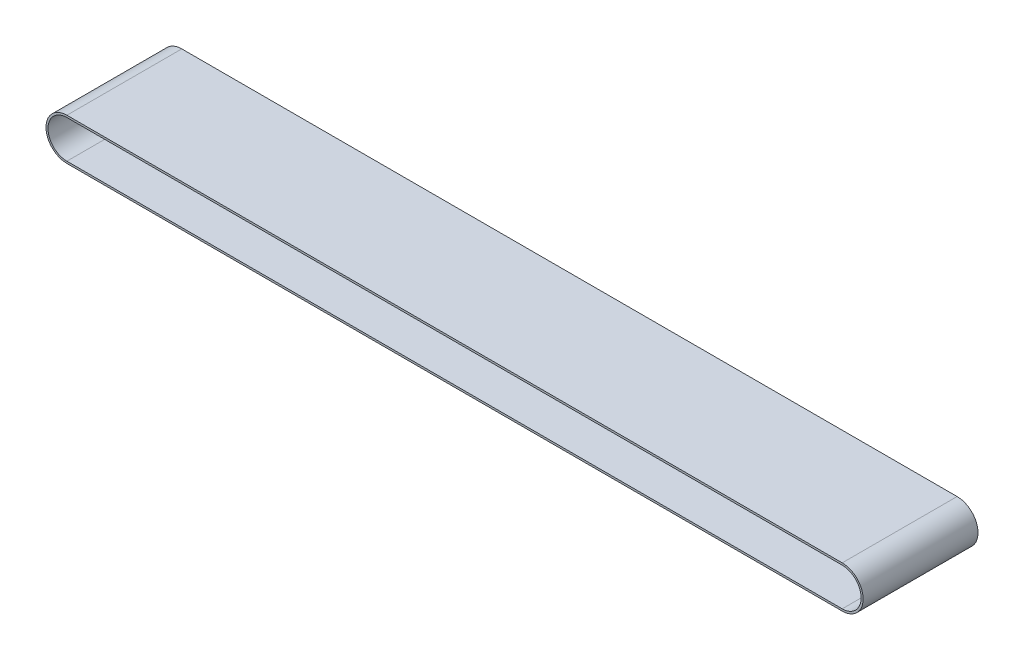
ISO-10303-21;
HEADER;
FILE_DESCRIPTION(('STEP AP214'),'2;1');
FILE_NAME('part.step','',(''),(''),'','','');
FILE_SCHEMA(('AUTOMOTIVE_DESIGN { 1 0 10303 214 1 1 1 1 }'));
ENDSEC;
DATA;
#1=APPLICATION_CONTEXT('core data for automotive mechanical design processes');
#2=APPLICATION_PROTOCOL_DEFINITION('international standard','automotive_design',2000,#1);
#3=PRODUCT_CONTEXT('',#1,'mechanical');
#4=PRODUCT('Part','Part','',(#3));
#5=PRODUCT_RELATED_PRODUCT_CATEGORY('part','',(#4));
#6=PRODUCT_DEFINITION_FORMATION('','',#4);
#7=PRODUCT_DEFINITION_CONTEXT('part definition',#1,'design');
#8=PRODUCT_DEFINITION('design','',#6,#7);
#9=PRODUCT_DEFINITION_SHAPE('','',#8);
#10=(LENGTH_UNIT() NAMED_UNIT(*) SI_UNIT(.MILLI.,.METRE.));
#11=(NAMED_UNIT(*) PLANE_ANGLE_UNIT() SI_UNIT($,.RADIAN.));
#12=(NAMED_UNIT(*) SI_UNIT($,.STERADIAN.) SOLID_ANGLE_UNIT());
#13=UNCERTAINTY_MEASURE_WITH_UNIT(LENGTH_MEASURE(1.E-05),#10,'distance_accuracy_value','');
#14=(GEOMETRIC_REPRESENTATION_CONTEXT(3) GLOBAL_UNCERTAINTY_ASSIGNED_CONTEXT((#13)) GLOBAL_UNIT_ASSIGNED_CONTEXT((#10,
#11,#12)) REPRESENTATION_CONTEXT('',''));
#15=CARTESIAN_POINT('',(0.,0.,0.));
#16=DIRECTION('',(0.,0.,1.));
#17=DIRECTION('',(1.,0.,0.));
#18=AXIS2_PLACEMENT_3D('',#15,#16,#17);
#19=CARTESIAN_POINT('',(0.,17.9,98.425));
#20=DIRECTION('',(0.,0.,-1.));
#21=DIRECTION('',(-1.,0.,0.));
#22=AXIS2_PLACEMENT_3D('',#19,#20,#21);
#23=CYLINDRICAL_SURFACE('',#22,17.9);
#24=CARTESIAN_POINT('',(0.,17.9,0.));
#25=DIRECTION('',(0.,0.,-1.));
#26=DIRECTION('',(-1.,0.,0.));
#27=AXIS2_PLACEMENT_3D('',#24,#25,#26);
#28=CIRCLE('',#27,17.9);
#29=CARTESIAN_POINT('',(0.,0.,0.));
#30=VERTEX_POINT('',#29);
#31=CARTESIAN_POINT('',(0.,35.8,0.));
#32=VERTEX_POINT('',#31);
#33=EDGE_CURVE('E113',#30,#32,#28,.T.);
#34=ORIENTED_EDGE('',*,*,#33,.F.);
#35=DIRECTION('',(0.,0.,-1.));
#36=VECTOR('',#35,1.);
#37=CARTESIAN_POINT('',(0.,0.,98.425));
#38=LINE('',#37,#36);
#39=CARTESIAN_POINT('',(0.,0.,98.425));
#40=VERTEX_POINT('',#39);
#41=EDGE_CURVE('E11',#40,#30,#38,.T.);
#42=ORIENTED_EDGE('',*,*,#41,.F.);
#43=CARTESIAN_POINT('',(0.,17.9,98.425));
#44=DIRECTION('',(0.,0.,-1.));
#45=DIRECTION('',(-1.,0.,0.));
#46=AXIS2_PLACEMENT_3D('',#43,#44,#45);
#47=CIRCLE('',#46,17.9);
#48=CARTESIAN_POINT('',(0.,35.8,98.425));
#49=VERTEX_POINT('',#48);
#50=EDGE_CURVE('E142',#40,#49,#47,.T.);
#51=ORIENTED_EDGE('',*,*,#50,.T.);
#52=DIRECTION('',(0.,0.,-1.));
#53=VECTOR('',#52,1.);
#54=CARTESIAN_POINT('',(0.,35.8,98.425));
#55=LINE('',#54,#53);
#56=EDGE_CURVE('E45',#49,#32,#55,.T.);
#57=ORIENTED_EDGE('',*,*,#56,.T.);
#58=EDGE_LOOP('',(#34,#42,#51,#57));
#59=FACE_BOUND('',#58,.T.);
#60=ADVANCED_FACE('F42',(#59),#23,.T.);
#61=CARTESIAN_POINT('',(0.,0.,98.425));
#62=DIRECTION('',(0.,1.,0.));
#63=DIRECTION('',(-1.,0.,0.));
#64=AXIS2_PLACEMENT_3D('',#61,#62,#63);
#65=PLANE('',#64);
#66=DIRECTION('',(1.,0.,0.));
#67=VECTOR('',#66,1.);
#68=CARTESIAN_POINT('',(0.,0.,0.));
#69=LINE('',#68,#67);
#70=CARTESIAN_POINT('',(664.20000002,0.,0.));
#71=VERTEX_POINT('',#70);
#72=EDGE_CURVE('E146',#30,#71,#69,.T.);
#73=ORIENTED_EDGE('',*,*,#72,.T.);
#74=DIRECTION('',(0.,0.,-1.));
#75=VECTOR('',#74,1.);
#76=CARTESIAN_POINT('',(664.20000002,0.,98.425));
#77=LINE('',#76,#75);
#78=CARTESIAN_POINT('',(664.20000002,0.,98.425));
#79=VERTEX_POINT('',#78);
#80=EDGE_CURVE('E50',#79,#71,#77,.T.);
#81=ORIENTED_EDGE('',*,*,#80,.F.);
#82=DIRECTION('',(1.,0.,0.));
#83=VECTOR('',#82,1.);
#84=CARTESIAN_POINT('',(0.,0.,98.425));
#85=LINE('',#84,#83);
#86=EDGE_CURVE('E152',#40,#79,#85,.T.);
#87=ORIENTED_EDGE('',*,*,#86,.F.);
#88=ORIENTED_EDGE('',*,*,#41,.T.);
#89=EDGE_LOOP('',(#73,#81,#87,#88));
#90=FACE_BOUND('',#89,.T.);
#91=ADVANCED_FACE('F176',(#90),#65,.F.);
#92=CARTESIAN_POINT('',(664.20000002,17.9,98.425));
#93=DIRECTION('',(0.,0.,-1.));
#94=DIRECTION('',(-1.,0.,0.));
#95=AXIS2_PLACEMENT_3D('',#92,#93,#94);
#96=CYLINDRICAL_SURFACE('',#95,17.9);
#97=CARTESIAN_POINT('',(664.20000002,17.9,0.));
#98=DIRECTION('',(0.,0.,-1.));
#99=DIRECTION('',(-1.,0.,0.));
#100=AXIS2_PLACEMENT_3D('',#97,#98,#99);
#101=CIRCLE('',#100,17.9);
#102=CARTESIAN_POINT('',(664.20000002,35.8,0.));
#103=VERTEX_POINT('',#102);
#104=EDGE_CURVE('E159',#103,#71,#101,.T.);
#105=ORIENTED_EDGE('',*,*,#104,.F.);
#106=DIRECTION('',(0.,0.,-1.));
#107=VECTOR('',#106,1.);
#108=CARTESIAN_POINT('',(664.20000002,35.8,98.425));
#109=LINE('',#108,#107);
#110=CARTESIAN_POINT('',(664.20000002,35.8,98.425));
#111=VERTEX_POINT('',#110);
#112=EDGE_CURVE('E164',#111,#103,#109,.T.);
#113=ORIENTED_EDGE('',*,*,#112,.F.);
#114=CARTESIAN_POINT('',(664.20000002,17.9,98.425));
#115=DIRECTION('',(0.,0.,-1.));
#116=DIRECTION('',(-1.,0.,0.));
#117=AXIS2_PLACEMENT_3D('',#114,#115,#116);
#118=CIRCLE('',#117,17.9);
#119=EDGE_CURVE('E149',#111,#79,#118,.T.);
#120=ORIENTED_EDGE('',*,*,#119,.T.);
#121=ORIENTED_EDGE('',*,*,#80,.T.);
#122=EDGE_LOOP('',(#105,#113,#120,#121));
#123=FACE_BOUND('',#122,.T.);
#124=ADVANCED_FACE('F182',(#123),#96,.T.);
#125=CARTESIAN_POINT('',(0.,35.8,98.425));
#126=DIRECTION('',(0.,1.,0.));
#127=DIRECTION('',(0.,0.,1.));
#128=AXIS2_PLACEMENT_3D('',#125,#126,#127);
#129=PLANE('',#128);
#130=DIRECTION('',(1.,0.,0.));
#131=VECTOR('',#130,1.);
#132=CARTESIAN_POINT('',(0.,35.8,0.));
#133=LINE('',#132,#131);
#134=EDGE_CURVE('E156',#32,#103,#133,.T.);
#135=ORIENTED_EDGE('',*,*,#134,.F.);
#136=ORIENTED_EDGE('',*,*,#56,.F.);
#137=DIRECTION('',(1.,0.,0.));
#138=VECTOR('',#137,1.);
#139=CARTESIAN_POINT('',(0.,35.8,98.425));
#140=LINE('',#139,#138);
#141=EDGE_CURVE('E145',#49,#111,#140,.T.);
#142=ORIENTED_EDGE('',*,*,#141,.T.);
#143=ORIENTED_EDGE('',*,*,#112,.T.);
#144=EDGE_LOOP('',(#135,#136,#142,#143));
#145=FACE_BOUND('',#144,.T.);
#146=ADVANCED_FACE('F172',(#145),#129,.T.);
#147=CARTESIAN_POINT('',(0.,17.9,98.425));
#148=DIRECTION('',(0.,0.,-1.));
#149=DIRECTION('',(-1.,0.,0.));
#150=AXIS2_PLACEMENT_3D('',#147,#148,#149);
#151=PLANE('',#150);
#152=DIRECTION('',(1.,0.,0.));
#153=VECTOR('',#152,1.);
#154=CARTESIAN_POINT('',(0.,1.7,98.425));
#155=LINE('',#154,#153);
#156=CARTESIAN_POINT('',(0.,1.7,98.425));
#157=VERTEX_POINT('',#156);
#158=CARTESIAN_POINT('',(664.20000002,1.7,98.425));
#159=VERTEX_POINT('',#158);
#160=EDGE_CURVE('E126',#157,#159,#155,.T.);
#161=ORIENTED_EDGE('',*,*,#160,.F.);
#162=CARTESIAN_POINT('',(0.,17.9,98.425));
#163=DIRECTION('',(0.,0.,1.));
#164=DIRECTION('',(1.,0.,0.));
#165=AXIS2_PLACEMENT_3D('',#162,#163,#164);
#166=CIRCLE('',#165,16.2);
#167=CARTESIAN_POINT('',(0.,34.1,98.425));
#168=VERTEX_POINT('',#167);
#169=EDGE_CURVE('E58',#168,#157,#166,.T.);
#170=ORIENTED_EDGE('',*,*,#169,.F.);
#171=DIRECTION('',(1.,0.,0.));
#172=VECTOR('',#171,1.);
#173=CARTESIAN_POINT('',(0.,34.1,98.425));
#174=LINE('',#173,#172);
#175=CARTESIAN_POINT('',(664.20000002,34.1,98.425));
#176=VERTEX_POINT('',#175);
#177=EDGE_CURVE('E119',#168,#176,#174,.T.);
#178=ORIENTED_EDGE('',*,*,#177,.T.);
#179=CARTESIAN_POINT('',(664.20000002,17.9,98.425));
#180=DIRECTION('',(0.,0.,-1.));
#181=DIRECTION('',(-1.,0.,0.));
#182=AXIS2_PLACEMENT_3D('',#179,#180,#181);
#183=CIRCLE('',#182,16.2);
#184=EDGE_CURVE('E133',#176,#159,#183,.T.);
#185=ORIENTED_EDGE('',*,*,#184,.T.);
#186=EDGE_LOOP('',(#161,#170,#178,#185));
#187=FACE_BOUND('',#186,.T.);
#188=ORIENTED_EDGE('',*,*,#50,.F.);
#189=ORIENTED_EDGE('',*,*,#86,.T.);
#190=ORIENTED_EDGE('',*,*,#119,.F.);
#191=ORIENTED_EDGE('',*,*,#141,.F.);
#192=EDGE_LOOP('',(#188,#189,#190,#191));
#193=FACE_BOUND('',#192,.T.);
#194=ADVANCED_FACE('F180',(#187,#193),#151,.F.);
#195=CARTESIAN_POINT('',(0.,17.9,0.));
#196=DIRECTION('',(0.,0.,-1.));
#197=DIRECTION('',(-1.,0.,0.));
#198=AXIS2_PLACEMENT_3D('',#195,#196,#197);
#199=PLANE('',#198);
#200=CARTESIAN_POINT('',(0.,17.9,0.));
#201=DIRECTION('',(0.,0.,-1.));
#202=DIRECTION('',(-1.,0.,0.));
#203=AXIS2_PLACEMENT_3D('',#200,#201,#202);
#204=CIRCLE('',#203,16.2);
#205=CARTESIAN_POINT('',(0.,34.1,0.));
#206=VERTEX_POINT('',#205);
#207=CARTESIAN_POINT('',(0.,1.7,0.));
#208=VERTEX_POINT('',#207);
#209=EDGE_CURVE('E117',#206,#208,#204,.F.);
#210=ORIENTED_EDGE('',*,*,#209,.T.);
#211=DIRECTION('',(1.,0.,0.));
#212=VECTOR('',#211,1.);
#213=CARTESIAN_POINT('',(0.,1.7,0.));
#214=LINE('',#213,#212);
#215=CARTESIAN_POINT('',(664.20000002,1.7,0.));
#216=VERTEX_POINT('',#215);
#217=EDGE_CURVE('E106',#208,#216,#214,.T.);
#218=ORIENTED_EDGE('',*,*,#217,.T.);
#219=CARTESIAN_POINT('',(664.20000002,17.9,0.));
#220=DIRECTION('',(0.,0.,-1.));
#221=DIRECTION('',(-1.,0.,0.));
#222=AXIS2_PLACEMENT_3D('',#219,#220,#221);
#223=CIRCLE('',#222,16.2);
#224=CARTESIAN_POINT('',(664.20000002,34.1,0.));
#225=VERTEX_POINT('',#224);
#226=EDGE_CURVE('E128',#225,#216,#223,.T.);
#227=ORIENTED_EDGE('',*,*,#226,.F.);
#228=DIRECTION('',(1.,0.,0.));
#229=VECTOR('',#228,1.);
#230=CARTESIAN_POINT('',(0.,34.1,0.));
#231=LINE('',#230,#229);
#232=EDGE_CURVE('E124',#206,#225,#231,.T.);
#233=ORIENTED_EDGE('',*,*,#232,.F.);
#234=EDGE_LOOP('',(#210,#218,#227,#233));
#235=FACE_BOUND('',#234,.T.);
#236=ORIENTED_EDGE('',*,*,#33,.T.);
#237=ORIENTED_EDGE('',*,*,#134,.T.);
#238=ORIENTED_EDGE('',*,*,#104,.T.);
#239=ORIENTED_EDGE('',*,*,#72,.F.);
#240=EDGE_LOOP('',(#236,#237,#238,#239));
#241=FACE_BOUND('',#240,.T.);
#242=ADVANCED_FACE('F122',(#235,#241),#199,.T.);
#243=CARTESIAN_POINT('',(0.,17.9,-0.001000000000001));
#244=DIRECTION('',(0.,0.,1.));
#245=DIRECTION('',(1.,0.,0.));
#246=AXIS2_PLACEMENT_3D('',#243,#244,#245);
#247=CYLINDRICAL_SURFACE('',#246,16.2);
#248=DIRECTION('',(0.,0.,1.));
#249=VECTOR('',#248,1.);
#250=CARTESIAN_POINT('',(0.,34.1,-0.001000000000001));
#251=LINE('',#250,#249);
#252=EDGE_CURVE('E114',#206,#168,#251,.T.);
#253=ORIENTED_EDGE('',*,*,#252,.T.);
#254=ORIENTED_EDGE('',*,*,#169,.T.);
#255=DIRECTION('',(0.,0.,1.));
#256=VECTOR('',#255,1.);
#257=CARTESIAN_POINT('',(0.,1.7,-0.001000000000001));
#258=LINE('',#257,#256);
#259=EDGE_CURVE('E108',#208,#157,#258,.T.);
#260=ORIENTED_EDGE('',*,*,#259,.F.);
#261=ORIENTED_EDGE('',*,*,#209,.F.);
#262=EDGE_LOOP('',(#253,#254,#260,#261));
#263=FACE_BOUND('',#262,.T.);
#264=ADVANCED_FACE('F116',(#263),#247,.F.);
#265=CARTESIAN_POINT('',(0.,34.1,-0.001000000000001));
#266=DIRECTION('',(0.,-1.,0.));
#267=DIRECTION('',(0.,0.,-1.));
#268=AXIS2_PLACEMENT_3D('',#265,#266,#267);
#269=PLANE('',#268);
#270=ORIENTED_EDGE('',*,*,#232,.T.);
#271=DIRECTION('',(0.,0.,1.));
#272=VECTOR('',#271,1.);
#273=CARTESIAN_POINT('',(664.20000002,34.1,-0.001000000000001));
#274=LINE('',#273,#272);
#275=EDGE_CURVE('E139',#225,#176,#274,.T.);
#276=ORIENTED_EDGE('',*,*,#275,.T.);
#277=ORIENTED_EDGE('',*,*,#177,.F.);
#278=ORIENTED_EDGE('',*,*,#252,.F.);
#279=EDGE_LOOP('',(#270,#276,#277,#278));
#280=FACE_BOUND('',#279,.T.);
#281=ADVANCED_FACE('F234',(#280),#269,.T.);
#282=CARTESIAN_POINT('',(664.20000002,17.9,-0.001000000000001));
#283=DIRECTION('',(0.,0.,1.));
#284=DIRECTION('',(1.,0.,0.));
#285=AXIS2_PLACEMENT_3D('',#282,#283,#284);
#286=CYLINDRICAL_SURFACE('',#285,16.2);
#287=ORIENTED_EDGE('',*,*,#226,.T.);
#288=DIRECTION('',(0.,0.,1.));
#289=VECTOR('',#288,1.);
#290=CARTESIAN_POINT('',(664.20000002,1.7,-0.001000000000001));
#291=LINE('',#290,#289);
#292=EDGE_CURVE('E66',#216,#159,#291,.T.);
#293=ORIENTED_EDGE('',*,*,#292,.T.);
#294=ORIENTED_EDGE('',*,*,#184,.F.);
#295=ORIENTED_EDGE('',*,*,#275,.F.);
#296=EDGE_LOOP('',(#287,#293,#294,#295));
#297=FACE_BOUND('',#296,.T.);
#298=ADVANCED_FACE('F226',(#297),#286,.F.);
#299=CARTESIAN_POINT('',(0.,1.7,-0.001000000000001));
#300=DIRECTION('',(0.,-1.,0.));
#301=DIRECTION('',(0.,0.,-1.));
#302=AXIS2_PLACEMENT_3D('',#299,#300,#301);
#303=PLANE('',#302);
#304=ORIENTED_EDGE('',*,*,#259,.T.);
#305=ORIENTED_EDGE('',*,*,#160,.T.);
#306=ORIENTED_EDGE('',*,*,#292,.F.);
#307=ORIENTED_EDGE('',*,*,#217,.F.);
#308=EDGE_LOOP('',(#304,#305,#306,#307));
#309=FACE_BOUND('',#308,.T.);
#310=ADVANCED_FACE('F107',(#309),#303,.F.);
#311=CLOSED_SHELL('',(#60,#91,#124,#146,#194,#242,#264,#281,#298,#310));
#312=MANIFOLD_SOLID_BREP('B2',#311);
#313=ADVANCED_BREP_SHAPE_REPRESENTATION('',(#18,#312),#14);
#314=SHAPE_DEFINITION_REPRESENTATION(#9,#313);
ENDSEC;
END-ISO-10303-21;
